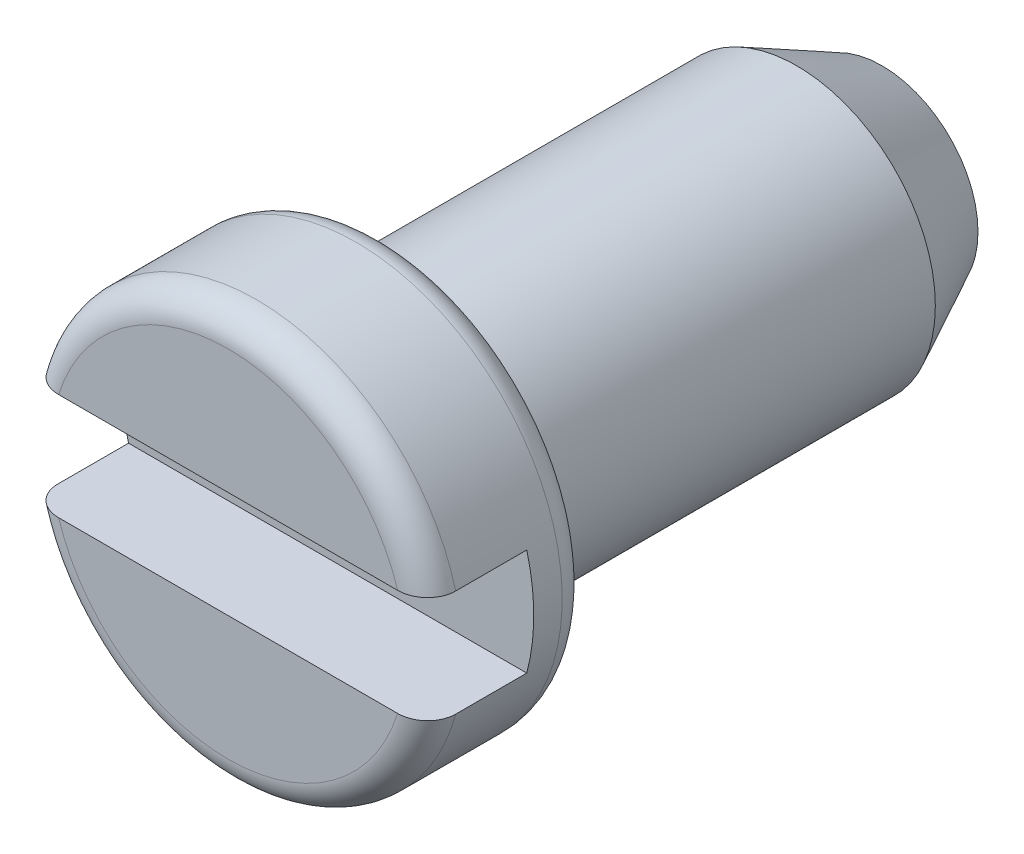
ISO-10303-21;
HEADER;
FILE_DESCRIPTION(('STEP AP214'),'2;1');
FILE_NAME('part.step','',(''),(''),'','','');
FILE_SCHEMA(('AUTOMOTIVE_DESIGN { 1 0 10303 214 1 1 1 1 }'));
ENDSEC;
DATA;
#1=APPLICATION_CONTEXT('core data for automotive mechanical design processes');
#2=APPLICATION_PROTOCOL_DEFINITION('international standard','automotive_design',2000,#1);
#3=PRODUCT_CONTEXT('',#1,'mechanical');
#4=PRODUCT('Part','Part','',(#3));
#5=PRODUCT_RELATED_PRODUCT_CATEGORY('part','',(#4));
#6=PRODUCT_DEFINITION_FORMATION('','',#4);
#7=PRODUCT_DEFINITION_CONTEXT('part definition',#1,'design');
#8=PRODUCT_DEFINITION('design','',#6,#7);
#9=PRODUCT_DEFINITION_SHAPE('','',#8);
#10=(LENGTH_UNIT() NAMED_UNIT(*) SI_UNIT(.MILLI.,.METRE.));
#11=(NAMED_UNIT(*) PLANE_ANGLE_UNIT() SI_UNIT($,.RADIAN.));
#12=(NAMED_UNIT(*) SI_UNIT($,.STERADIAN.) SOLID_ANGLE_UNIT());
#13=UNCERTAINTY_MEASURE_WITH_UNIT(LENGTH_MEASURE(1.E-05),#10,'distance_accuracy_value','');
#14=(GEOMETRIC_REPRESENTATION_CONTEXT(3) GLOBAL_UNCERTAINTY_ASSIGNED_CONTEXT((#13)) GLOBAL_UNIT_ASSIGNED_CONTEXT((#10,
#11,#12)) REPRESENTATION_CONTEXT('',''));
#15=CARTESIAN_POINT('',(0.,0.,0.));
#16=DIRECTION('',(0.,0.,1.));
#17=DIRECTION('',(1.,0.,0.));
#18=AXIS2_PLACEMENT_3D('',#15,#16,#17);
#19=CARTESIAN_POINT('',(0.,0.,0.55));
#20=DIRECTION('',(0.,0.,1.));
#21=DIRECTION('',(-1.,0.,0.));
#22=AXIS2_PLACEMENT_3D('',#19,#20,#21);
#23=CYLINDRICAL_SURFACE('',#22,1.45);
#24=CARTESIAN_POINT('',(0.,0.,-0.35));
#25=DIRECTION('',(0.,0.,-1.));
#26=DIRECTION('',(-1.,0.,0.));
#27=AXIS2_PLACEMENT_3D('',#24,#25,#26);
#28=CIRCLE('',#27,1.45);
#29=CARTESIAN_POINT('',(-1.45,0.,-0.35));
#30=VERTEX_POINT('',#29);
#31=EDGE_CURVE('E11',#30,#30,#28,.T.);
#32=ORIENTED_EDGE('',*,*,#31,.F.);
#33=CARTESIAN_POINT('',(-1.45,0.,-0.35));
#34=CARTESIAN_POINT('',(-1.45,0.,-0.15));
#35=B_SPLINE_CURVE_WITH_KNOTS('',1,(#33,#34),.UNSPECIFIED.,.F.,.F.,(2,2),(-0.9,-0.7),.UNSPECIFIED.);
#36=CARTESIAN_POINT('',(-1.45,0.,-0.15));
#37=VERTEX_POINT('',#36);
#38=EDGE_CURVE('E23',#30,#37,#35,.T.);
#39=ORIENTED_EDGE('',*,*,#38,.T.);
#40=CARTESIAN_POINT('',(0.,0.,-0.15));
#41=DIRECTION('',(0.,0.,-1.));
#42=DIRECTION('',(-1.,0.,0.));
#43=AXIS2_PLACEMENT_3D('',#40,#41,#42);
#44=CIRCLE('',#43,1.45);
#45=CARTESIAN_POINT('',(-1.40066948278314,0.375,-0.15));
#46=VERTEX_POINT('',#45);
#47=EDGE_CURVE('E291',#37,#46,#44,.T.);
#48=ORIENTED_EDGE('',*,*,#47,.T.);
#49=DIRECTION('',(0.,0.,-1.));
#50=VECTOR('',#49,1.);
#51=CARTESIAN_POINT('',(-1.40066948278314,0.375,0.55));
#52=LINE('',#51,#50);
#53=CARTESIAN_POINT('',(-1.40066948278314,0.375,0.35));
#54=VERTEX_POINT('',#53);
#55=EDGE_CURVE('E287',#54,#46,#52,.T.);
#56=ORIENTED_EDGE('',*,*,#55,.F.);
#57=CARTESIAN_POINT('',(0.,0.,0.35));
#58=DIRECTION('',(0.,0.,-1.));
#59=DIRECTION('',(-1.,0.,0.));
#60=AXIS2_PLACEMENT_3D('',#57,#58,#59);
#61=CIRCLE('',#60,1.45);
#62=CARTESIAN_POINT('',(1.40066948278314,0.375,0.35));
#63=VERTEX_POINT('',#62);
#64=EDGE_CURVE('E283',#54,#63,#61,.T.);
#65=ORIENTED_EDGE('',*,*,#64,.T.);
#66=DIRECTION('',(0.,0.,-1.));
#67=VECTOR('',#66,1.);
#68=CARTESIAN_POINT('',(1.40066948278314,0.375,0.55));
#69=LINE('',#68,#67);
#70=CARTESIAN_POINT('',(1.40066948278314,0.375,-0.15));
#71=VERTEX_POINT('',#70);
#72=EDGE_CURVE('E279',#63,#71,#69,.T.);
#73=ORIENTED_EDGE('',*,*,#72,.T.);
#74=CARTESIAN_POINT('',(0.,0.,-0.15));
#75=DIRECTION('',(0.,0.,-1.));
#76=DIRECTION('',(-1.,0.,0.));
#77=AXIS2_PLACEMENT_3D('',#74,#75,#76);
#78=CIRCLE('',#77,1.45);
#79=CARTESIAN_POINT('',(1.40066948278314,-0.375,-0.15));
#80=VERTEX_POINT('',#79);
#81=EDGE_CURVE('E277',#71,#80,#78,.T.);
#82=ORIENTED_EDGE('',*,*,#81,.T.);
#83=DIRECTION('',(0.,0.,-1.));
#84=VECTOR('',#83,1.);
#85=CARTESIAN_POINT('',(1.40066948278314,-0.375,0.55));
#86=LINE('',#85,#84);
#87=CARTESIAN_POINT('',(1.40066948278314,-0.375,0.35));
#88=VERTEX_POINT('',#87);
#89=EDGE_CURVE('E272',#88,#80,#86,.T.);
#90=ORIENTED_EDGE('',*,*,#89,.F.);
#91=CARTESIAN_POINT('',(0.,0.,0.35));
#92=DIRECTION('',(0.,0.,-1.));
#93=DIRECTION('',(-1.,0.,0.));
#94=AXIS2_PLACEMENT_3D('',#91,#92,#93);
#95=CIRCLE('',#94,1.45);
#96=CARTESIAN_POINT('',(-1.40066948278314,-0.375,0.35));
#97=VERTEX_POINT('',#96);
#98=EDGE_CURVE('E267',#88,#97,#95,.T.);
#99=ORIENTED_EDGE('',*,*,#98,.T.);
#100=DIRECTION('',(0.,0.,-1.));
#101=VECTOR('',#100,1.);
#102=CARTESIAN_POINT('',(-1.40066948278314,-0.375,0.55));
#103=LINE('',#102,#101);
#104=CARTESIAN_POINT('',(-1.40066948278314,-0.375,-0.15));
#105=VERTEX_POINT('',#104);
#106=EDGE_CURVE('E265',#97,#105,#103,.T.);
#107=ORIENTED_EDGE('',*,*,#106,.T.);
#108=EDGE_CURVE('E268',#105,#37,#44,.T.);
#109=ORIENTED_EDGE('',*,*,#108,.T.);
#110=ORIENTED_EDGE('',*,*,#38,.F.);
#111=EDGE_LOOP('',(#32,#39,#48,#56,#65,#73,#82,#90,#99,#107,#109,#110));
#112=FACE_BOUND('',#111,.T.);
#113=ADVANCED_FACE('F16',(#112),#23,.T.);
#114=CARTESIAN_POINT('',(0.,0.,0.35));
#115=DIRECTION('',(0.,0.,-1.));
#116=DIRECTION('',(-1.,0.,0.));
#117=AXIS2_PLACEMENT_3D('',#114,#115,#116);
#118=TOROIDAL_SURFACE('',#117,1.25,0.2);
#119=CARTESIAN_POINT('',(-1.19242400177118,0.375,0.55));
#120=CARTESIAN_POINT('',(-1.24634909528174,0.375,0.55));
#121=CARTESIAN_POINT('',(-1.29933454957924,0.375,0.52964656525384));
#122=CARTESIAN_POINT('',(-1.37714093425716,0.375,0.456429377948307));
#123=CARTESIAN_POINT('',(-1.40066948278334,0.375,0.403994622188162));
#124=CARTESIAN_POINT('',(-1.40066948278335,0.375,0.350000000000039));
#125=B_SPLINE_CURVE_WITH_KNOTS('',3,(#119,#120,#121,#122,#123,#124),.UNSPECIFIED.,.F.,.F.,(4,2,
4),(0.,0.000159533449450624,0.000319066898901247),.UNSPECIFIED.);
#126=CARTESIAN_POINT('',(-1.19242400177118,0.375,0.55));
#127=VERTEX_POINT('',#126);
#128=EDGE_CURVE('E249',#127,#54,#125,.T.);
#129=ORIENTED_EDGE('',*,*,#128,.F.);
#130=CARTESIAN_POINT('',(0.,0.,0.55));
#131=DIRECTION('',(0.,0.,-1.));
#132=DIRECTION('',(-1.,0.,0.));
#133=AXIS2_PLACEMENT_3D('',#130,#131,#132);
#134=CIRCLE('',#133,1.25);
#135=CARTESIAN_POINT('',(1.19242400177118,0.375,0.55));
#136=VERTEX_POINT('',#135);
#137=EDGE_CURVE('E239',#127,#136,#134,.T.);
#138=ORIENTED_EDGE('',*,*,#137,.T.);
#139=CARTESIAN_POINT('',(1.40066948278314,0.375,0.35));
#140=CARTESIAN_POINT('',(1.40066948278314,0.375,0.403952845761374));
#141=CARTESIAN_POINT('',(1.37708304432918,0.375,0.456426978220546));
#142=CARTESIAN_POINT('',(1.29962265536758,0.375,0.529432159055147));
#143=CARTESIAN_POINT('',(1.24631743045732,0.375,0.55));
#144=CARTESIAN_POINT('',(1.19242400177118,0.375,0.55));
#145=B_SPLINE_CURVE_WITH_KNOTS('',3,(#139,#140,#141,#142,#143,#144),.UNSPECIFIED.,.F.,.F.,(4,2,
4),(0.,0.000159531367934928,0.000319062735869856),.UNSPECIFIED.);
#146=EDGE_CURVE('E216',#63,#136,#145,.T.);
#147=ORIENTED_EDGE('',*,*,#146,.F.);
#148=ORIENTED_EDGE('',*,*,#64,.F.);
#149=EDGE_LOOP('',(#129,#138,#147,#148));
#150=FACE_BOUND('',#149,.T.);
#151=ADVANCED_FACE('F222',(#150),#118,.T.);
#152=CARTESIAN_POINT('',(-2.,0.375,-0.15));
#153=DIRECTION('',(0.,-1.,0.));
#154=DIRECTION('',(1.,0.,0.));
#155=AXIS2_PLACEMENT_3D('',#152,#153,#154);
#156=PLANE('',#155);
#157=ORIENTED_EDGE('',*,*,#72,.F.);
#158=ORIENTED_EDGE('',*,*,#146,.T.);
#159=DIRECTION('',(1.,0.,0.));
#160=VECTOR('',#159,1.);
#161=CARTESIAN_POINT('',(-2.,0.375,0.55));
#162=LINE('',#161,#160);
#163=EDGE_CURVE('E211',#127,#136,#162,.T.);
#164=ORIENTED_EDGE('',*,*,#163,.F.);
#165=ORIENTED_EDGE('',*,*,#128,.T.);
#166=ORIENTED_EDGE('',*,*,#55,.T.);
#167=DIRECTION('',(1.,0.,0.));
#168=VECTOR('',#167,1.);
#169=CARTESIAN_POINT('',(-2.,0.375,-0.15));
#170=LINE('',#169,#168);
#171=EDGE_CURVE('E208',#46,#71,#170,.T.);
#172=ORIENTED_EDGE('',*,*,#171,.T.);
#173=EDGE_LOOP('',(#157,#158,#164,#165,#166,#172));
#174=FACE_BOUND('',#173,.T.);
#175=ADVANCED_FACE('F230',(#174),#156,.T.);
#176=CARTESIAN_POINT('',(0.,0.,-0.15));
#177=DIRECTION('',(0.,0.,-1.));
#178=DIRECTION('',(-1.,0.,0.));
#179=AXIS2_PLACEMENT_3D('',#176,#177,#178);
#180=PLANE('',#179);
#181=ORIENTED_EDGE('',*,*,#81,.F.);
#182=ORIENTED_EDGE('',*,*,#171,.F.);
#183=ORIENTED_EDGE('',*,*,#47,.F.);
#184=ORIENTED_EDGE('',*,*,#108,.F.);
#185=DIRECTION('',(-1.,0.,0.));
#186=VECTOR('',#185,1.);
#187=CARTESIAN_POINT('',(2.,-0.375,-0.15));
#188=LINE('',#187,#186);
#189=EDGE_CURVE('E205',#80,#105,#188,.T.);
#190=ORIENTED_EDGE('',*,*,#189,.F.);
#191=EDGE_LOOP('',(#181,#182,#183,#184,#190));
#192=FACE_BOUND('',#191,.T.);
#193=ADVANCED_FACE('F185',(#192),#180,.F.);
#194=CARTESIAN_POINT('',(2.,-0.375,-0.15));
#195=DIRECTION('',(0.,1.,0.));
#196=DIRECTION('',(-1.,0.,0.));
#197=AXIS2_PLACEMENT_3D('',#194,#195,#196);
#198=PLANE('',#197);
#199=ORIENTED_EDGE('',*,*,#106,.F.);
#200=CARTESIAN_POINT('',(-1.40066948278314,-0.375,0.35));
#201=CARTESIAN_POINT('',(-1.40066948278314,-0.375,0.403952845761374));
#202=CARTESIAN_POINT('',(-1.37708304432918,-0.375,0.456426978220546));
#203=CARTESIAN_POINT('',(-1.29962265536758,-0.375,0.529432159055147));
#204=CARTESIAN_POINT('',(-1.24631743045732,-0.375,0.55));
#205=CARTESIAN_POINT('',(-1.19242400177118,-0.375,0.55));
#206=B_SPLINE_CURVE_WITH_KNOTS('',3,(#200,#201,#202,#203,#204,#205),.UNSPECIFIED.,.F.,.F.,(4,2,
4),(0.,0.000159531367934928,0.000319062735869856),.UNSPECIFIED.);
#207=CARTESIAN_POINT('',(-1.19242400177118,-0.375,0.55));
#208=VERTEX_POINT('',#207);
#209=EDGE_CURVE('E203',#97,#208,#206,.T.);
#210=ORIENTED_EDGE('',*,*,#209,.T.);
#211=DIRECTION('',(-1.,0.,0.));
#212=VECTOR('',#211,1.);
#213=CARTESIAN_POINT('',(2.,-0.375,0.55));
#214=LINE('',#213,#212);
#215=CARTESIAN_POINT('',(1.19242400177118,-0.375,0.55));
#216=VERTEX_POINT('',#215);
#217=EDGE_CURVE('E455',#216,#208,#214,.T.);
#218=ORIENTED_EDGE('',*,*,#217,.F.);
#219=CARTESIAN_POINT('',(1.19242400177118,-0.375,0.55));
#220=CARTESIAN_POINT('',(1.24634909528174,-0.375,0.55));
#221=CARTESIAN_POINT('',(1.29933454957924,-0.375,0.52964656525384));
#222=CARTESIAN_POINT('',(1.37714093425716,-0.375,0.456429377948307));
#223=CARTESIAN_POINT('',(1.40066948278334,-0.375,0.403994622188162));
#224=CARTESIAN_POINT('',(1.40066948278335,-0.375,0.350000000000039));
#225=B_SPLINE_CURVE_WITH_KNOTS('',3,(#219,#220,#221,#222,#223,#224),.UNSPECIFIED.,.F.,.F.,(4,2,
4),(0.,0.000159533449450624,0.000319066898901247),.UNSPECIFIED.);
#226=EDGE_CURVE('E157',#216,#88,#225,.T.);
#227=ORIENTED_EDGE('',*,*,#226,.T.);
#228=ORIENTED_EDGE('',*,*,#89,.T.);
#229=ORIENTED_EDGE('',*,*,#189,.T.);
#230=EDGE_LOOP('',(#199,#210,#218,#227,#228,#229));
#231=FACE_BOUND('',#230,.T.);
#232=ADVANCED_FACE('F176',(#231),#198,.T.);
#233=CARTESIAN_POINT('',(0.,0.,0.35));
#234=DIRECTION('',(0.,0.,-1.));
#235=DIRECTION('',(-1.,0.,0.));
#236=AXIS2_PLACEMENT_3D('',#233,#234,#235);
#237=TOROIDAL_SURFACE('',#236,1.25,0.2);
#238=ORIENTED_EDGE('',*,*,#226,.F.);
#239=CARTESIAN_POINT('',(0.,0.,0.55));
#240=DIRECTION('',(0.,0.,-1.));
#241=DIRECTION('',(-1.,0.,0.));
#242=AXIS2_PLACEMENT_3D('',#239,#240,#241);
#243=CIRCLE('',#242,1.25);
#244=EDGE_CURVE('E154',#216,#208,#243,.T.);
#245=ORIENTED_EDGE('',*,*,#244,.T.);
#246=ORIENTED_EDGE('',*,*,#209,.F.);
#247=ORIENTED_EDGE('',*,*,#98,.F.);
#248=EDGE_LOOP('',(#238,#245,#246,#247));
#249=FACE_BOUND('',#248,.T.);
#250=ADVANCED_FACE('F137',(#249),#237,.T.);
#251=CARTESIAN_POINT('',(0.,0.,-0.35));
#252=DIRECTION('',(0.,0.,-1.));
#253=DIRECTION('',(-1.,0.,0.));
#254=AXIS2_PLACEMENT_3D('',#251,#252,#253);
#255=TOROIDAL_SURFACE('',#254,1.25,0.2);
#256=ORIENTED_EDGE('',*,*,#31,.T.);
#257=CARTESIAN_POINT('',(-1.45,0.,-0.35));
#258=CARTESIAN_POINT('',(-1.45000006941776,0.,-0.353272495652178));
#259=CARTESIAN_POINT('',(-1.44991968342503,0.,-0.356544985397586));
#260=CARTESIAN_POINT('',(-1.44959849905704,0.,-0.363082084333382));
#261=CARTESIAN_POINT('',(-1.44935770068177,0.,-0.366346693523771));
#262=CARTESIAN_POINT('',(-1.44871618998711,0.,-0.372860162608053));
#263=CARTESIAN_POINT('',(-1.44831547766771,0.,-0.376109022501947));
#264=CARTESIAN_POINT('',(-1.4473551263182,0.,-0.382583167280198));
#265=CARTESIAN_POINT('',(-1.44679548728808,0.,-0.385808452164555));
#266=CARTESIAN_POINT('',(-1.44551862487321,0.,-0.392227676641897));
#267=CARTESIAN_POINT('',(-1.44480140148846,0.,-0.395421616234881));
#268=CARTESIAN_POINT('',(-1.44321109978936,0.,-0.401770455726425));
#269=CARTESIAN_POINT('',(-1.44233802147501,0.,-0.404925355624983));
#270=CARTESIAN_POINT('',(-1.44043811281787,0.,-0.411188515276802));
#271=CARTESIAN_POINT('',(-1.43941128247509,0.,-0.414296775030062));
#272=CARTESIAN_POINT('',(-1.43720634359812,0.,-0.420459166326827));
#273=CARTESIAN_POINT('',(-1.43602823506393,0.,-0.423513297870332));
#274=CARTESIAN_POINT('',(-1.43352357794058,0.,-0.429560075075704));
#275=CARTESIAN_POINT('',(-1.43219702935142,0.,-0.432552720737571));
#276=CARTESIAN_POINT('',(-1.42939868789796,0.,-0.438469316634541));
#277=CARTESIAN_POINT('',(-1.42792689503366,0.,-0.441393266869644));
#278=CARTESIAN_POINT('',(-1.42484161070568,0.,-0.447165427860755));
#279=CARTESIAN_POINT('',(-1.423228119242,0.,-0.450013638616762));
#280=CARTESIAN_POINT('',(-1.41986332475811,0.,-0.455627459060526));
#281=CARTESIAN_POINT('',(-1.41811202173789,0.,-0.458393068748282));
#282=CARTESIAN_POINT('',(-1.41447582318313,0.,-0.463835024459559));
#283=CARTESIAN_POINT('',(-1.41259092764859,0.,-0.466511370483079));
#284=CARTESIAN_POINT('',(-1.40869208494367,0.,-0.471768351313895));
#285=CARTESIAN_POINT('',(-1.40667813777329,0.,-0.47434898612119));
#286=CARTESIAN_POINT('',(-1.40252604357181,0.,-0.479408327544268));
#287=CARTESIAN_POINT('',(-1.40038789654071,0.,-0.481887034160051));
#288=CARTESIAN_POINT('',(-1.39599255360127,0.,-0.486736547778757));
#289=CARTESIAN_POINT('',(-1.39373535769294,0.,-0.48910735478168));
#290=CARTESIAN_POINT('',(-1.38910735478168,0.,-0.493735357692939));
#291=CARTESIAN_POINT('',(-1.38673654777876,0.,-0.495992553601275));
#292=CARTESIAN_POINT('',(-1.38188703416005,0.,-0.500387896540709));
#293=CARTESIAN_POINT('',(-1.37940832754427,0.,-0.502526043571808));
#294=CARTESIAN_POINT('',(-1.37434898612119,0.,-0.506678137773287));
#295=CARTESIAN_POINT('',(-1.37176835131389,0.,-0.508692084943668));
#296=CARTESIAN_POINT('',(-1.36651137048308,0.,-0.51259092764859));
#297=CARTESIAN_POINT('',(-1.36383502445956,0.,-0.51447582318313));
#298=CARTESIAN_POINT('',(-1.35839306874828,0.,-0.518112021737888));
#299=CARTESIAN_POINT('',(-1.35562745906053,0.,-0.519863324758106));
#300=CARTESIAN_POINT('',(-1.35001363861676,0.,-0.523228119242003));
#301=CARTESIAN_POINT('',(-1.34716542786075,0.,-0.524841610705682));
#302=CARTESIAN_POINT('',(-1.34139326686964,0.,-0.52792689503366));
#303=CARTESIAN_POINT('',(-1.33846931663454,0.,-0.529398687897958));
#304=CARTESIAN_POINT('',(-1.33255272073757,0.,-0.532197029351419));
#305=CARTESIAN_POINT('',(-1.3295600750757,0.,-0.533523577940583));
#306=CARTESIAN_POINT('',(-1.32351329787033,0.,-0.536028235063932));
#307=CARTESIAN_POINT('',(-1.32045916632683,0.,-0.537206343598119));
#308=CARTESIAN_POINT('',(-1.31429677503006,0.,-0.53941128247509));
#309=CARTESIAN_POINT('',(-1.3111885152768,0.,-0.540438112817875));
#310=CARTESIAN_POINT('',(-1.30492535562498,0.,-0.542338021475009));
#311=CARTESIAN_POINT('',(-1.30177045572642,0.,-0.543211099789358));
#312=CARTESIAN_POINT('',(-1.29542161623488,0.,-0.544801401488459));
#313=CARTESIAN_POINT('',(-1.2922276766419,0.,-0.545518624873211));
#314=CARTESIAN_POINT('',(-1.28580845216455,0.,-0.546795487288081));
#315=CARTESIAN_POINT('',(-1.2825831672802,0.,-0.547355126318199));
#316=CARTESIAN_POINT('',(-1.27610902250195,0.,-0.548315477667713));
#317=CARTESIAN_POINT('',(-1.27286016260805,0.,-0.548716189987108));
#318=CARTESIAN_POINT('',(-1.26634669352377,0.,-0.549357700681771));
#319=CARTESIAN_POINT('',(-1.26308208433338,0.,-0.549598499057038));
#320=CARTESIAN_POINT('',(-1.25654498539759,0.,-0.549919683425031));
#321=CARTESIAN_POINT('',(-1.25327249565218,0.,-0.550000069417755));
#322=CARTESIAN_POINT('',(-1.25,0.,-0.55));
#323=B_SPLINE_CURVE_WITH_KNOTS('',3,(#257,#258,#259,#260,#261,#262,#263,#264,#265,#266,#267,
#268,#269,#270,#271,#272,#273,#274,#275,#276,#277,#278,#279,#280,#281,#282,#283,#284,#285,#286,
#287,#288,#289,#290,#291,#292,#293,#294,#295,#296,#297,#298,#299,#300,#301,#302,#303,#304,#305,
#306,#307,#308,#309,#310,#311,#312,#313,#314,#315,#316,#317,#318,#319,#320,#321,#322),
.UNSPECIFIED.,.F.,.F.,(4,2,2,2,2,2,2,2,2,2,2,2,2,2,2,2,2,2,2,2,2,2,2,2,2,2,2,2,2,2,2,2,4),(0.,
0.00981649140916488,0.0196329828183298,0.0294494742274949,0.0392659656366597,0.0490824570458246,
0.0588989484549895,0.0687154398641545,0.0785319312733195,0.0883484226824841,0.098164914091649,
0.107981405500814,0.117797896909979,0.127614388319144,0.137430879728309,0.147247371137474,
0.157063862546639,0.166880353955803,0.176696845364968,0.186513336774133,0.196329828183298,
0.206146319592463,0.215962811001628,0.225779302410793,0.235595793819958,0.245412285229123,
0.255228776638288,0.265045268047453,0.274861759456618,0.284678250865782,0.294494742274947,
0.304311233684112,0.314127725093277),.UNSPECIFIED.);
#324=CARTESIAN_POINT('',(-1.25,0.,-0.55));
#325=VERTEX_POINT('',#324);
#326=EDGE_CURVE('E120',#30,#325,#323,.T.);
#327=ORIENTED_EDGE('',*,*,#326,.T.);
#328=CARTESIAN_POINT('',(0.,0.,-0.55));
#329=DIRECTION('',(0.,0.,-1.));
#330=DIRECTION('',(-1.,0.,0.));
#331=AXIS2_PLACEMENT_3D('',#328,#329,#330);
#332=CIRCLE('',#331,1.25);
#333=EDGE_CURVE('E115',#325,#325,#332,.T.);
#334=ORIENTED_EDGE('',*,*,#333,.F.);
#335=ORIENTED_EDGE('',*,*,#326,.F.);
#336=EDGE_LOOP('',(#256,#327,#334,#335));
#337=FACE_BOUND('',#336,.T.);
#338=ADVANCED_FACE('F126',(#337),#255,.T.);
#339=CARTESIAN_POINT('',(0.,0.,-3.45));
#340=DIRECTION('',(0.,0.,1.));
#341=DIRECTION('',(1.,0.,0.));
#342=AXIS2_PLACEMENT_3D('',#339,#340,#341);
#343=CONICAL_SURFACE('',#342,0.975,0.463647609000806);
#344=CARTESIAN_POINT('',(0.,0.,-4.05));
#345=DIRECTION('',(0.,0.,1.));
#346=DIRECTION('',(1.,0.,0.));
#347=AXIS2_PLACEMENT_3D('',#344,#345,#346);
#348=CIRCLE('',#347,0.675);
#349=CARTESIAN_POINT('',(0.675,0.,-4.05));
#350=VERTEX_POINT('',#349);
#351=EDGE_CURVE('E110',#350,#350,#348,.T.);
#352=ORIENTED_EDGE('',*,*,#351,.T.);
#353=CARTESIAN_POINT('',(0.675,0.,-4.05));
#354=CARTESIAN_POINT('',(0.975,0.,-3.45));
#355=B_SPLINE_CURVE_WITH_KNOTS('',1,(#353,#354),.UNSPECIFIED.,.F.,.F.,(2,2),(-0.670820393249937,
0.),.UNSPECIFIED.);
#356=CARTESIAN_POINT('',(0.975,0.,-3.45));
#357=VERTEX_POINT('',#356);
#358=EDGE_CURVE('E106',#350,#357,#355,.T.);
#359=ORIENTED_EDGE('',*,*,#358,.T.);
#360=CARTESIAN_POINT('',(0.,0.,-3.45));
#361=DIRECTION('',(0.,0.,1.));
#362=DIRECTION('',(1.,0.,0.));
#363=AXIS2_PLACEMENT_3D('',#360,#361,#362);
#364=CIRCLE('',#363,0.975);
#365=EDGE_CURVE('E94',#357,#357,#364,.T.);
#366=ORIENTED_EDGE('',*,*,#365,.F.);
#367=ORIENTED_EDGE('',*,*,#358,.F.);
#368=EDGE_LOOP('',(#352,#359,#366,#367));
#369=FACE_BOUND('',#368,.T.);
#370=ADVANCED_FACE('F136',(#369),#343,.T.);
#371=CARTESIAN_POINT('',(0.,0.,0.55));
#372=DIRECTION('',(0.,0.,-1.));
#373=DIRECTION('',(-1.,0.,0.));
#374=AXIS2_PLACEMENT_3D('',#371,#372,#373);
#375=PLANE('',#374);
#376=ORIENTED_EDGE('',*,*,#217,.T.);
#377=ORIENTED_EDGE('',*,*,#244,.F.);
#378=EDGE_LOOP('',(#376,#377));
#379=FACE_BOUND('',#378,.T.);
#380=ADVANCED_FACE('F309',(#379),#375,.F.);
#381=CARTESIAN_POINT('',(0.,0.,0.55));
#382=DIRECTION('',(0.,0.,-1.));
#383=DIRECTION('',(-1.,0.,0.));
#384=AXIS2_PLACEMENT_3D('',#381,#382,#383);
#385=PLANE('',#384);
#386=ORIENTED_EDGE('',*,*,#163,.T.);
#387=ORIENTED_EDGE('',*,*,#137,.F.);
#388=EDGE_LOOP('',(#386,#387));
#389=FACE_BOUND('',#388,.T.);
#390=ADVANCED_FACE('F307',(#389),#385,.F.);
#391=CARTESIAN_POINT('',(0.,0.,-0.55));
#392=DIRECTION('',(0.,0.,-1.));
#393=DIRECTION('',(-1.,0.,0.));
#394=AXIS2_PLACEMENT_3D('',#391,#392,#393);
#395=PLANE('',#394);
#396=ORIENTED_EDGE('',*,*,#333,.T.);
#397=EDGE_LOOP('',(#396));
#398=FACE_BOUND('',#397,.T.);
#399=CARTESIAN_POINT('',(0.,0.,-0.55));
#400=DIRECTION('',(0.,0.,-1.));
#401=DIRECTION('',(-1.,0.,0.));
#402=AXIS2_PLACEMENT_3D('',#399,#400,#401);
#403=CIRCLE('',#402,0.975);
#404=CARTESIAN_POINT('',(-0.975,0.,-0.55));
#405=VERTEX_POINT('',#404);
#406=CARTESIAN_POINT('',(0.975,0.,-0.55));
#407=VERTEX_POINT('',#406);
#408=EDGE_CURVE('E86',#405,#407,#403,.T.);
#409=ORIENTED_EDGE('',*,*,#408,.F.);
#410=EDGE_CURVE('E92',#407,#405,#403,.T.);
#411=ORIENTED_EDGE('',*,*,#410,.F.);
#412=EDGE_LOOP('',(#409,#411));
#413=FACE_BOUND('',#412,.T.);
#414=ADVANCED_FACE('F96',(#398,#413),#395,.T.);
#415=CARTESIAN_POINT('',(0.,0.,-4.05));
#416=DIRECTION('',(0.,0.,-1.));
#417=DIRECTION('',(1.,0.,0.));
#418=AXIS2_PLACEMENT_3D('',#415,#416,#417);
#419=CYLINDRICAL_SURFACE('',#418,0.975);
#420=ORIENTED_EDGE('',*,*,#365,.T.);
#421=CARTESIAN_POINT('',(0.975,0.,-0.55));
#422=CARTESIAN_POINT('',(0.975,0.,-3.45));
#423=B_SPLINE_CURVE_WITH_KNOTS('',1,(#421,#422),.UNSPECIFIED.,.F.,.F.,(2,2),(-3.5,-0.6),.UNSPECIFIED.);
#424=EDGE_CURVE('E91',#407,#357,#423,.T.);
#425=ORIENTED_EDGE('',*,*,#424,.F.);
#426=ORIENTED_EDGE('',*,*,#410,.T.);
#427=ORIENTED_EDGE('',*,*,#408,.T.);
#428=ORIENTED_EDGE('',*,*,#424,.T.);
#429=EDGE_LOOP('',(#420,#425,#426,#427,#428));
#430=FACE_BOUND('',#429,.T.);
#431=ADVANCED_FACE('F89',(#430),#419,.T.);
#432=CARTESIAN_POINT('',(0.,0.,-4.05));
#433=DIRECTION('',(0.,0.,1.));
#434=DIRECTION('',(1.,0.,0.));
#435=AXIS2_PLACEMENT_3D('',#432,#433,#434);
#436=PLANE('',#435);
#437=ORIENTED_EDGE('',*,*,#351,.F.);
#438=EDGE_LOOP('',(#437));
#439=FACE_BOUND('',#438,.T.);
#440=ADVANCED_FACE('F395',(#439),#436,.F.);
#441=CLOSED_SHELL('',(#113,#151,#175,#193,#232,#250,#338,#370,#380,#390,#414,#431,#440));
#442=MANIFOLD_SOLID_BREP('B1',#441);
#443=ADVANCED_BREP_SHAPE_REPRESENTATION('',(#18,#442),#14);
#444=SHAPE_DEFINITION_REPRESENTATION(#9,#443);
ENDSEC;
END-ISO-10303-21;
